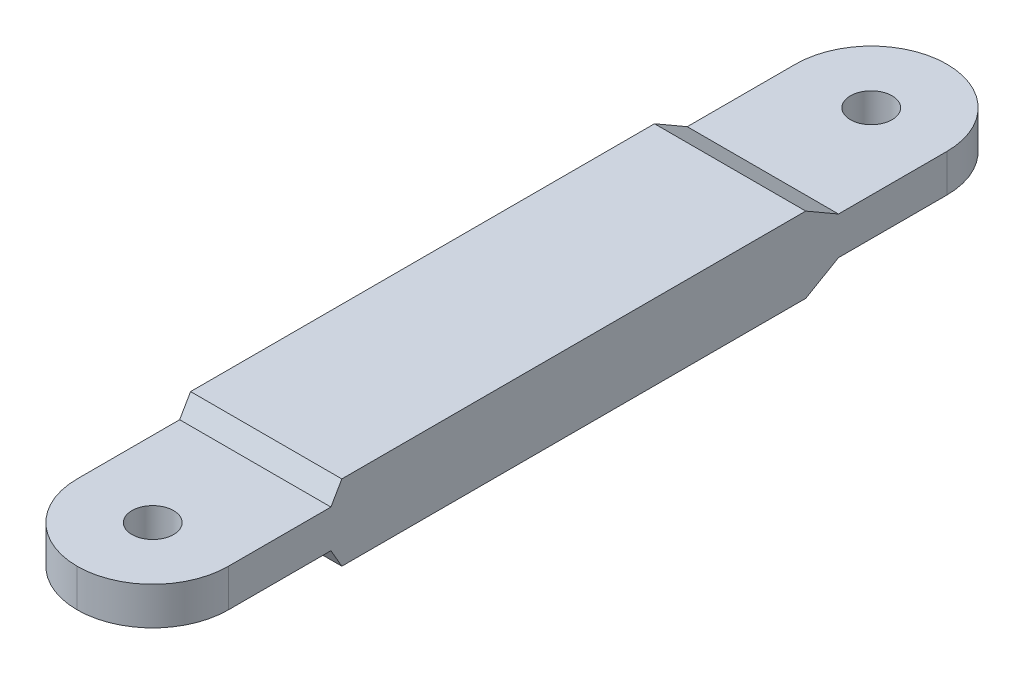
ISO-10303-21;
HEADER;
FILE_DESCRIPTION(('STEP AP214'),'2;1');
FILE_NAME('part.step','',(''),(''),'','','');
FILE_SCHEMA(('AUTOMOTIVE_DESIGN { 1 0 10303 214 1 1 1 1 }'));
ENDSEC;
DATA;
#1=APPLICATION_CONTEXT('core data for automotive mechanical design processes');
#2=APPLICATION_PROTOCOL_DEFINITION('international standard','automotive_design',2000,#1);
#3=PRODUCT_CONTEXT('',#1,'mechanical');
#4=PRODUCT('Part','Part','',(#3));
#5=PRODUCT_RELATED_PRODUCT_CATEGORY('part','',(#4));
#6=PRODUCT_DEFINITION_FORMATION('','',#4);
#7=PRODUCT_DEFINITION_CONTEXT('part definition',#1,'design');
#8=PRODUCT_DEFINITION('design','',#6,#7);
#9=PRODUCT_DEFINITION_SHAPE('','',#8);
#10=(LENGTH_UNIT() NAMED_UNIT(*) SI_UNIT(.MILLI.,.METRE.));
#11=(NAMED_UNIT(*) PLANE_ANGLE_UNIT() SI_UNIT($,.RADIAN.));
#12=(NAMED_UNIT(*) SI_UNIT($,.STERADIAN.) SOLID_ANGLE_UNIT());
#13=UNCERTAINTY_MEASURE_WITH_UNIT(LENGTH_MEASURE(1.E-05),#10,'distance_accuracy_value','');
#14=(GEOMETRIC_REPRESENTATION_CONTEXT(3) GLOBAL_UNCERTAINTY_ASSIGNED_CONTEXT((#13)) GLOBAL_UNIT_ASSIGNED_CONTEXT((#10,
#11,#12)) REPRESENTATION_CONTEXT('',''));
#15=CARTESIAN_POINT('',(0.,0.,0.));
#16=DIRECTION('',(0.,0.,1.));
#17=DIRECTION('',(1.,0.,0.));
#18=AXIS2_PLACEMENT_3D('',#15,#16,#17);
#19=CARTESIAN_POINT('',(-10.,-5.,-37.5));
#20=DIRECTION('',(-1.,0.,0.));
#21=DIRECTION('',(0.,0.,1.));
#22=AXIS2_PLACEMENT_3D('',#19,#20,#21);
#23=PLANE('',#22);
#24=DIRECTION('',(0.,0.866025403784441,0.499999999999996));
#25=VECTOR('',#24,1.);
#26=CARTESIAN_POINT('',(-10.,-35.3108891324552,15.0000000000002));
#27=LINE('',#26,#25);
#28=CARTESIAN_POINT('',(-10.,-5.,32.4999999999999));
#29=VERTEX_POINT('',#28);
#30=CARTESIAN_POINT('',(-10.,-2.5,33.943375672974));
#31=VERTEX_POINT('',#30);
#32=EDGE_CURVE('E254',#29,#31,#27,.T.);
#33=ORIENTED_EDGE('',*,*,#32,.T.);
#34=DIRECTION('',(0.,0.,-1.));
#35=VECTOR('',#34,1.);
#36=CARTESIAN_POINT('',(-10.,-2.5,57.5));
#37=LINE('',#36,#35);
#38=CARTESIAN_POINT('',(-10.,-2.5,47.5));
#39=VERTEX_POINT('',#38);
#40=EDGE_CURVE('E57',#39,#31,#37,.T.);
#41=ORIENTED_EDGE('',*,*,#40,.F.);
#42=DIRECTION('',(0.,1.,0.));
#43=VECTOR('',#42,1.);
#44=CARTESIAN_POINT('',(-10.,-5.,47.5));
#45=LINE('',#44,#43);
#46=CARTESIAN_POINT('',(-10.,2.5,47.5));
#47=VERTEX_POINT('',#46);
#48=EDGE_CURVE('E157',#39,#47,#45,.T.);
#49=ORIENTED_EDGE('',*,*,#48,.T.);
#50=DIRECTION('',(0.,0.,-1.));
#51=VECTOR('',#50,1.);
#52=CARTESIAN_POINT('',(-10.,2.5,57.5));
#53=LINE('',#52,#51);
#54=CARTESIAN_POINT('',(-10.,2.5,33.943375672974));
#55=VERTEX_POINT('',#54);
#56=EDGE_CURVE('E277',#47,#55,#53,.T.);
#57=ORIENTED_EDGE('',*,*,#56,.T.);
#58=DIRECTION('',(0.,0.866025403784441,-0.499999999999996));
#59=VECTOR('',#58,1.);
#60=CARTESIAN_POINT('',(-10.,27.8108891324551,19.3301270189224));
#61=LINE('',#60,#59);
#62=CARTESIAN_POINT('',(-10.,5.,32.4999999999999));
#63=VERTEX_POINT('',#62);
#64=EDGE_CURVE('E251',#55,#63,#61,.T.);
#65=ORIENTED_EDGE('',*,*,#64,.T.);
#66=DIRECTION('',(0.,0.,1.));
#67=VECTOR('',#66,1.);
#68=CARTESIAN_POINT('',(-10.,5.,-37.5));
#69=LINE('',#68,#67);
#70=CARTESIAN_POINT('',(-10.,5.,-28.8397459621554));
#71=VERTEX_POINT('',#70);
#72=EDGE_CURVE('E173',#71,#63,#69,.T.);
#73=ORIENTED_EDGE('',*,*,#72,.F.);
#74=DIRECTION('',(0.,0.499999999999997,0.866025403784441));
#75=VECTOR('',#74,1.);
#76=CARTESIAN_POINT('',(-10.,-1.25000000000003,-39.6650635094611));
#77=LINE('',#76,#75);
#78=CARTESIAN_POINT('',(-10.,2.5,-33.1698729810777));
#79=VERTEX_POINT('',#78);
#80=EDGE_CURVE('E248',#71,#79,#77,.F.);
#81=ORIENTED_EDGE('',*,*,#80,.T.);
#82=DIRECTION('',(0.,0.,1.));
#83=VECTOR('',#82,1.);
#84=CARTESIAN_POINT('',(-10.,2.5,-57.5));
#85=LINE('',#84,#83);
#86=CARTESIAN_POINT('',(-10.,2.5,-47.5));
#87=VERTEX_POINT('',#86);
#88=EDGE_CURVE('E74',#87,#79,#85,.T.);
#89=ORIENTED_EDGE('',*,*,#88,.F.);
#90=DIRECTION('',(0.,1.,0.));
#91=VECTOR('',#90,1.);
#92=CARTESIAN_POINT('',(-10.,-5.,-47.5));
#93=LINE('',#92,#91);
#94=CARTESIAN_POINT('',(-10.,-2.5,-47.5));
#95=VERTEX_POINT('',#94);
#96=EDGE_CURVE('E177',#87,#95,#93,.F.);
#97=ORIENTED_EDGE('',*,*,#96,.T.);
#98=DIRECTION('',(0.,0.,1.));
#99=VECTOR('',#98,1.);
#100=CARTESIAN_POINT('',(-10.,-2.5,-57.5));
#101=LINE('',#100,#99);
#102=CARTESIAN_POINT('',(-10.,-2.5,-33.1698729810777));
#103=VERTEX_POINT('',#102);
#104=EDGE_CURVE('E82',#95,#103,#101,.T.);
#105=ORIENTED_EDGE('',*,*,#104,.T.);
#106=DIRECTION('',(0.,0.499999999999997,-0.866025403784441));
#107=VECTOR('',#106,1.);
#108=CARTESIAN_POINT('',(-10.,-1.24999999999994,-35.3349364905389));
#109=LINE('',#108,#107);
#110=CARTESIAN_POINT('',(-10.,-5.,-28.8397459621554));
#111=VERTEX_POINT('',#110);
#112=EDGE_CURVE('E245',#103,#111,#109,.F.);
#113=ORIENTED_EDGE('',*,*,#112,.T.);
#114=DIRECTION('',(0.,0.,1.));
#115=VECTOR('',#114,1.);
#116=CARTESIAN_POINT('',(-10.,-5.,-37.5));
#117=LINE('',#116,#115);
#118=EDGE_CURVE('E183',#111,#29,#117,.T.);
#119=ORIENTED_EDGE('',*,*,#118,.T.);
#120=EDGE_LOOP('',(#33,#41,#49,#57,#65,#73,#81,#89,#97,#105,#113,#119));
#121=FACE_BOUND('',#120,.T.);
#122=ADVANCED_FACE('F39',(#121),#23,.T.);
#123=CARTESIAN_POINT('',(-10.,5.,-37.5));
#124=DIRECTION('',(0.,1.,0.));
#125=DIRECTION('',(0.,0.,1.));
#126=AXIS2_PLACEMENT_3D('',#123,#124,#125);
#127=PLANE('',#126);
#128=ORIENTED_EDGE('',*,*,#72,.T.);
#129=DIRECTION('',(1.,0.,0.));
#130=VECTOR('',#129,1.);
#131=CARTESIAN_POINT('',(10.,5.,32.4999999999999));
#132=LINE('',#131,#130);
#133=CARTESIAN_POINT('',(10.,5.,32.4999999999999));
#134=VERTEX_POINT('',#133);
#135=EDGE_CURVE('E261',#63,#134,#132,.T.);
#136=ORIENTED_EDGE('',*,*,#135,.T.);
#137=DIRECTION('',(0.,0.,1.));
#138=VECTOR('',#137,1.);
#139=CARTESIAN_POINT('',(10.,5.,-37.5));
#140=LINE('',#139,#138);
#141=CARTESIAN_POINT('',(10.,5.,-28.8397459621554));
#142=VERTEX_POINT('',#141);
#143=EDGE_CURVE('E180',#142,#134,#140,.T.);
#144=ORIENTED_EDGE('',*,*,#143,.F.);
#145=DIRECTION('',(-1.,0.,0.));
#146=VECTOR('',#145,1.);
#147=CARTESIAN_POINT('',(-10.,5.,-28.8397459621554));
#148=LINE('',#147,#146);
#149=EDGE_CURVE('E257',#142,#71,#148,.T.);
#150=ORIENTED_EDGE('',*,*,#149,.T.);
#151=EDGE_LOOP('',(#128,#136,#144,#150));
#152=FACE_BOUND('',#151,.T.);
#153=ADVANCED_FACE('F285',(#152),#127,.T.);
#154=CARTESIAN_POINT('',(10.,-5.,-37.5));
#155=DIRECTION('',(1.,0.,0.));
#156=DIRECTION('',(0.,0.,-1.));
#157=AXIS2_PLACEMENT_3D('',#154,#155,#156);
#158=PLANE('',#157);
#159=DIRECTION('',(0.,0.,-1.));
#160=VECTOR('',#159,1.);
#161=CARTESIAN_POINT('',(10.,-2.5,57.5));
#162=LINE('',#161,#160);
#163=CARTESIAN_POINT('',(10.,-2.5,47.5));
#164=VERTEX_POINT('',#163);
#165=CARTESIAN_POINT('',(10.,-2.5,33.943375672974));
#166=VERTEX_POINT('',#165);
#167=EDGE_CURVE('E219',#164,#166,#162,.T.);
#168=ORIENTED_EDGE('',*,*,#167,.T.);
#169=DIRECTION('',(0.,-0.866025403784441,-0.499999999999996));
#170=VECTOR('',#169,1.);
#171=CARTESIAN_POINT('',(10.,-35.3108891324552,15.0000000000002));
#172=LINE('',#171,#170);
#173=CARTESIAN_POINT('',(10.,-5.,32.4999999999999));
#174=VERTEX_POINT('',#173);
#175=EDGE_CURVE('E234',#166,#174,#172,.T.);
#176=ORIENTED_EDGE('',*,*,#175,.T.);
#177=DIRECTION('',(0.,0.,1.));
#178=VECTOR('',#177,1.);
#179=CARTESIAN_POINT('',(10.,-5.,-37.5));
#180=LINE('',#179,#178);
#181=CARTESIAN_POINT('',(10.,-5.,-28.8397459621554));
#182=VERTEX_POINT('',#181);
#183=EDGE_CURVE('E306',#182,#174,#180,.T.);
#184=ORIENTED_EDGE('',*,*,#183,.F.);
#185=DIRECTION('',(0.,-0.499999999999997,0.866025403784441));
#186=VECTOR('',#185,1.);
#187=CARTESIAN_POINT('',(10.,-1.24999999999994,-35.3349364905389));
#188=LINE('',#187,#186);
#189=CARTESIAN_POINT('',(10.,-2.5,-33.1698729810777));
#190=VERTEX_POINT('',#189);
#191=EDGE_CURVE('E214',#182,#190,#188,.F.);
#192=ORIENTED_EDGE('',*,*,#191,.T.);
#193=DIRECTION('',(0.,0.,1.));
#194=VECTOR('',#193,1.);
#195=CARTESIAN_POINT('',(10.,-2.5,-57.5));
#196=LINE('',#195,#194);
#197=CARTESIAN_POINT('',(10.,-2.5,-47.5));
#198=VERTEX_POINT('',#197);
#199=EDGE_CURVE('E152',#198,#190,#196,.T.);
#200=ORIENTED_EDGE('',*,*,#199,.F.);
#201=DIRECTION('',(0.,-1.,0.));
#202=VECTOR('',#201,1.);
#203=CARTESIAN_POINT('',(10.,-5.,-47.5));
#204=LINE('',#203,#202);
#205=CARTESIAN_POINT('',(10.,2.5,-47.5));
#206=VERTEX_POINT('',#205);
#207=EDGE_CURVE('E146',#198,#206,#204,.F.);
#208=ORIENTED_EDGE('',*,*,#207,.T.);
#209=DIRECTION('',(0.,0.,1.));
#210=VECTOR('',#209,1.);
#211=CARTESIAN_POINT('',(10.,2.5,-57.5));
#212=LINE('',#211,#210);
#213=CARTESIAN_POINT('',(10.,2.5,-33.1698729810777));
#214=VERTEX_POINT('',#213);
#215=EDGE_CURVE('E149',#206,#214,#212,.T.);
#216=ORIENTED_EDGE('',*,*,#215,.T.);
#217=DIRECTION('',(0.,-0.499999999999997,-0.866025403784441));
#218=VECTOR('',#217,1.);
#219=CARTESIAN_POINT('',(10.,-1.25000000000003,-39.6650635094611));
#220=LINE('',#219,#218);
#221=EDGE_CURVE('E227',#214,#142,#220,.F.);
#222=ORIENTED_EDGE('',*,*,#221,.T.);
#223=ORIENTED_EDGE('',*,*,#143,.T.);
#224=DIRECTION('',(0.,-0.866025403784441,0.499999999999996));
#225=VECTOR('',#224,1.);
#226=CARTESIAN_POINT('',(10.,27.8108891324551,19.3301270189224));
#227=LINE('',#226,#225);
#228=CARTESIAN_POINT('',(10.,2.5,33.943375672974));
#229=VERTEX_POINT('',#228);
#230=EDGE_CURVE('E230',#134,#229,#227,.T.);
#231=ORIENTED_EDGE('',*,*,#230,.T.);
#232=DIRECTION('',(0.,0.,-1.));
#233=VECTOR('',#232,1.);
#234=CARTESIAN_POINT('',(10.,2.5,57.5));
#235=LINE('',#234,#233);
#236=CARTESIAN_POINT('',(10.,2.5,47.5));
#237=VERTEX_POINT('',#236);
#238=EDGE_CURVE('E279',#237,#229,#235,.T.);
#239=ORIENTED_EDGE('',*,*,#238,.F.);
#240=DIRECTION('',(0.,-1.,0.));
#241=VECTOR('',#240,1.);
#242=CARTESIAN_POINT('',(10.,-5.,47.5));
#243=LINE('',#242,#241);
#244=EDGE_CURVE('E211',#237,#164,#243,.T.);
#245=ORIENTED_EDGE('',*,*,#244,.T.);
#246=EDGE_LOOP('',(#168,#176,#184,#192,#200,#208,#216,#222,#223,#231,#239,#245));
#247=FACE_BOUND('',#246,.T.);
#248=ADVANCED_FACE('F148',(#247),#158,.T.);
#249=CARTESIAN_POINT('',(-10.,-5.,-37.5));
#250=DIRECTION('',(0.,-1.,0.));
#251=DIRECTION('',(0.,0.,-1.));
#252=AXIS2_PLACEMENT_3D('',#249,#250,#251);
#253=PLANE('',#252);
#254=ORIENTED_EDGE('',*,*,#183,.T.);
#255=DIRECTION('',(-1.,0.,0.));
#256=VECTOR('',#255,1.);
#257=CARTESIAN_POINT('',(-10.,-5.,32.4999999999999));
#258=LINE('',#257,#256);
#259=EDGE_CURVE('E241',#174,#29,#258,.T.);
#260=ORIENTED_EDGE('',*,*,#259,.T.);
#261=ORIENTED_EDGE('',*,*,#118,.F.);
#262=DIRECTION('',(1.,0.,0.));
#263=VECTOR('',#262,1.);
#264=CARTESIAN_POINT('',(-10.,-5.,-28.8397459621554));
#265=LINE('',#264,#263);
#266=EDGE_CURVE('E237',#111,#182,#265,.T.);
#267=ORIENTED_EDGE('',*,*,#266,.T.);
#268=EDGE_LOOP('',(#254,#260,#261,#267));
#269=FACE_BOUND('',#268,.T.);
#270=ADVANCED_FACE('F317',(#269),#253,.T.);
#271=CARTESIAN_POINT('',(10.,-2.5,-57.5));
#272=DIRECTION('',(0.,1.,0.));
#273=DIRECTION('',(0.,0.,1.));
#274=AXIS2_PLACEMENT_3D('',#271,#272,#273);
#275=PLANE('',#274);
#276=CARTESIAN_POINT('',(0.,-2.5,-47.5));
#277=DIRECTION('',(0.,1.,0.));
#278=DIRECTION('',(0.,0.,1.));
#279=AXIS2_PLACEMENT_3D('',#276,#277,#278);
#280=CIRCLE('',#279,2.75);
#281=CARTESIAN_POINT('',(0.,-2.5,-44.75));
#282=VERTEX_POINT('',#281);
#283=EDGE_CURVE('E195',#282,#282,#280,.T.);
#284=ORIENTED_EDGE('',*,*,#283,.T.);
#285=EDGE_LOOP('',(#284));
#286=FACE_BOUND('',#285,.T.);
#287=ORIENTED_EDGE('',*,*,#104,.F.);
#288=CARTESIAN_POINT('',(0.,-2.5,-47.5));
#289=DIRECTION('',(0.,1.,0.));
#290=DIRECTION('',(0.,0.,1.));
#291=AXIS2_PLACEMENT_3D('',#288,#289,#290);
#292=CIRCLE('',#291,10.);
#293=CARTESIAN_POINT('',(0.,-2.5,-57.5));
#294=VERTEX_POINT('',#293);
#295=EDGE_CURVE('E158',#95,#294,#292,.F.);
#296=ORIENTED_EDGE('',*,*,#295,.T.);
#297=CARTESIAN_POINT('',(0.,-2.5,-47.5));
#298=DIRECTION('',(0.,1.,0.));
#299=DIRECTION('',(0.,0.,1.));
#300=AXIS2_PLACEMENT_3D('',#297,#298,#299);
#301=CIRCLE('',#300,10.);
#302=EDGE_CURVE('E188',#294,#198,#301,.F.);
#303=ORIENTED_EDGE('',*,*,#302,.T.);
#304=ORIENTED_EDGE('',*,*,#199,.T.);
#305=DIRECTION('',(1.,0.,0.));
#306=VECTOR('',#305,1.);
#307=CARTESIAN_POINT('',(10.,-2.5,-33.1698729810777));
#308=LINE('',#307,#306);
#309=EDGE_CURVE('E11',#190,#103,#308,.F.);
#310=ORIENTED_EDGE('',*,*,#309,.T.);
#311=EDGE_LOOP('',(#287,#296,#303,#304,#310));
#312=FACE_BOUND('',#311,.T.);
#313=ADVANCED_FACE('F297',(#286,#312),#275,.F.);
#314=CARTESIAN_POINT('',(10.,2.5,-57.5));
#315=DIRECTION('',(0.,-1.,0.));
#316=DIRECTION('',(0.,0.,-1.));
#317=AXIS2_PLACEMENT_3D('',#314,#315,#316);
#318=PLANE('',#317);
#319=CARTESIAN_POINT('',(0.,2.5,-47.5));
#320=DIRECTION('',(0.,1.,0.));
#321=DIRECTION('',(0.,0.,1.));
#322=AXIS2_PLACEMENT_3D('',#319,#320,#321);
#323=CIRCLE('',#322,2.75);
#324=CARTESIAN_POINT('',(0.,2.5,-44.75));
#325=VERTEX_POINT('',#324);
#326=EDGE_CURVE('E344',#325,#325,#323,.T.);
#327=ORIENTED_EDGE('',*,*,#326,.F.);
#328=EDGE_LOOP('',(#327));
#329=FACE_BOUND('',#328,.T.);
#330=CARTESIAN_POINT('',(0.,2.5,-47.5));
#331=DIRECTION('',(0.,-1.,0.));
#332=DIRECTION('',(0.,0.,-1.));
#333=AXIS2_PLACEMENT_3D('',#330,#331,#332);
#334=CIRCLE('',#333,10.);
#335=CARTESIAN_POINT('',(0.,2.5,-57.5));
#336=VERTEX_POINT('',#335);
#337=EDGE_CURVE('E161',#206,#336,#334,.F.);
#338=ORIENTED_EDGE('',*,*,#337,.T.);
#339=CARTESIAN_POINT('',(0.,2.5,-47.5));
#340=DIRECTION('',(0.,-1.,0.));
#341=DIRECTION('',(0.,0.,-1.));
#342=AXIS2_PLACEMENT_3D('',#339,#340,#341);
#343=CIRCLE('',#342,10.);
#344=EDGE_CURVE('E172',#336,#87,#343,.F.);
#345=ORIENTED_EDGE('',*,*,#344,.T.);
#346=ORIENTED_EDGE('',*,*,#88,.T.);
#347=DIRECTION('',(-1.,0.,0.));
#348=VECTOR('',#347,1.);
#349=CARTESIAN_POINT('',(10.,2.5,-33.1698729810777));
#350=LINE('',#349,#348);
#351=EDGE_CURVE('E49',#79,#214,#350,.F.);
#352=ORIENTED_EDGE('',*,*,#351,.T.);
#353=ORIENTED_EDGE('',*,*,#215,.F.);
#354=EDGE_LOOP('',(#338,#345,#346,#352,#353));
#355=FACE_BOUND('',#354,.T.);
#356=ADVANCED_FACE('F160',(#329,#355),#318,.F.);
#357=CARTESIAN_POINT('',(0.,0.,-47.5));
#358=DIRECTION('',(0.,-1.,0.));
#359=DIRECTION('',(0.,0.,-1.));
#360=AXIS2_PLACEMENT_3D('',#357,#358,#359);
#361=CYLINDRICAL_SURFACE('',#360,10.);
#362=ORIENTED_EDGE('',*,*,#207,.F.);
#363=ORIENTED_EDGE('',*,*,#302,.F.);
#364=DIRECTION('',(0.,-1.,0.));
#365=VECTOR('',#364,1.);
#366=CARTESIAN_POINT('',(0.,0.,-57.5));
#367=LINE('',#366,#365);
#368=EDGE_CURVE('E166',#336,#294,#367,.T.);
#369=ORIENTED_EDGE('',*,*,#368,.F.);
#370=ORIENTED_EDGE('',*,*,#337,.F.);
#371=EDGE_LOOP('',(#362,#363,#369,#370));
#372=FACE_BOUND('',#371,.T.);
#373=ADVANCED_FACE('F168',(#372),#361,.T.);
#374=CARTESIAN_POINT('',(0.,0.,-47.5));
#375=DIRECTION('',(0.,1.,0.));
#376=DIRECTION('',(0.,0.,1.));
#377=AXIS2_PLACEMENT_3D('',#374,#375,#376);
#378=CYLINDRICAL_SURFACE('',#377,10.);
#379=ORIENTED_EDGE('',*,*,#295,.F.);
#380=ORIENTED_EDGE('',*,*,#96,.F.);
#381=ORIENTED_EDGE('',*,*,#344,.F.);
#382=ORIENTED_EDGE('',*,*,#368,.T.);
#383=EDGE_LOOP('',(#379,#380,#381,#382));
#384=FACE_BOUND('',#383,.T.);
#385=ADVANCED_FACE('F295',(#384),#378,.T.);
#386=CARTESIAN_POINT('',(0.,-5.,-47.5));
#387=DIRECTION('',(0.,1.,0.));
#388=DIRECTION('',(0.,0.,1.));
#389=AXIS2_PLACEMENT_3D('',#386,#387,#388);
#390=CYLINDRICAL_SURFACE('',#389,2.75);
#391=CARTESIAN_POINT('',(0.,2.5,-44.75));
#392=CARTESIAN_POINT('',(0.,2.44791666666667,-44.75));
#393=CARTESIAN_POINT('',(0.,2.39583333333333,-44.75));
#394=CARTESIAN_POINT('',(0.,2.29166666666667,-44.75));
#395=CARTESIAN_POINT('',(0.,2.23958333333333,-44.75));
#396=CARTESIAN_POINT('',(0.,2.13541666666667,-44.75));
#397=CARTESIAN_POINT('',(0.,2.08333333333333,-44.75));
#398=CARTESIAN_POINT('',(0.,1.97916666666667,-44.75));
#399=CARTESIAN_POINT('',(0.,1.92708333333333,-44.75));
#400=CARTESIAN_POINT('',(0.,1.82291666666667,-44.75));
#401=CARTESIAN_POINT('',(0.,1.77083333333333,-44.75));
#402=CARTESIAN_POINT('',(0.,1.66666666666667,-44.75));
#403=CARTESIAN_POINT('',(0.,1.61458333333333,-44.75));
#404=CARTESIAN_POINT('',(0.,1.51041666666667,-44.75));
#405=CARTESIAN_POINT('',(0.,1.45833333333333,-44.75));
#406=CARTESIAN_POINT('',(0.,1.35416666666667,-44.75));
#407=CARTESIAN_POINT('',(0.,1.30208333333333,-44.75));
#408=CARTESIAN_POINT('',(0.,1.19791666666667,-44.75));
#409=CARTESIAN_POINT('',(0.,1.14583333333333,-44.75));
#410=CARTESIAN_POINT('',(0.,1.04166666666667,-44.75));
#411=CARTESIAN_POINT('',(0.,0.989583333333333,-44.75));
#412=CARTESIAN_POINT('',(0.,0.885416666666667,-44.75));
#413=CARTESIAN_POINT('',(0.,0.833333333333333,-44.75));
#414=CARTESIAN_POINT('',(0.,0.729166666666667,-44.75));
#415=CARTESIAN_POINT('',(0.,0.677083333333333,-44.75));
#416=CARTESIAN_POINT('',(0.,0.572916666666666,-44.75));
#417=CARTESIAN_POINT('',(0.,0.520833333333333,-44.75));
#418=CARTESIAN_POINT('',(0.,0.416666666666666,-44.75));
#419=CARTESIAN_POINT('',(0.,0.364583333333333,-44.75));
#420=CARTESIAN_POINT('',(0.,0.260416666666667,-44.75));
#421=CARTESIAN_POINT('',(0.,0.208333333333334,-44.75));
#422=CARTESIAN_POINT('',(0.,0.104166666666667,-44.75));
#423=CARTESIAN_POINT('',(0.,0.0520833333333334,-44.75));
#424=CARTESIAN_POINT('',(0.,-0.0520833333333334,-44.75));
#425=CARTESIAN_POINT('',(0.,-0.104166666666667,-44.75));
#426=CARTESIAN_POINT('',(0.,-0.208333333333334,-44.75));
#427=CARTESIAN_POINT('',(0.,-0.260416666666667,-44.75));
#428=CARTESIAN_POINT('',(0.,-0.364583333333334,-44.75));
#429=CARTESIAN_POINT('',(0.,-0.416666666666667,-44.75));
#430=CARTESIAN_POINT('',(0.,-0.520833333333334,-44.75));
#431=CARTESIAN_POINT('',(0.,-0.572916666666667,-44.75));
#432=CARTESIAN_POINT('',(0.,-0.677083333333334,-44.75));
#433=CARTESIAN_POINT('',(0.,-0.729166666666667,-44.75));
#434=CARTESIAN_POINT('',(0.,-0.833333333333334,-44.75));
#435=CARTESIAN_POINT('',(0.,-0.885416666666668,-44.75));
#436=CARTESIAN_POINT('',(0.,-0.989583333333334,-44.75));
#437=CARTESIAN_POINT('',(0.,-1.04166666666667,-44.75));
#438=CARTESIAN_POINT('',(0.,-1.14583333333333,-44.75));
#439=CARTESIAN_POINT('',(0.,-1.19791666666667,-44.75));
#440=CARTESIAN_POINT('',(0.,-1.30208333333333,-44.75));
#441=CARTESIAN_POINT('',(0.,-1.35416666666667,-44.75));
#442=CARTESIAN_POINT('',(0.,-1.45833333333333,-44.75));
#443=CARTESIAN_POINT('',(0.,-1.51041666666667,-44.75));
#444=CARTESIAN_POINT('',(0.,-1.61458333333333,-44.75));
#445=CARTESIAN_POINT('',(0.,-1.66666666666667,-44.75));
#446=CARTESIAN_POINT('',(0.,-1.77083333333333,-44.75));
#447=CARTESIAN_POINT('',(0.,-1.82291666666667,-44.75));
#448=CARTESIAN_POINT('',(0.,-1.92708333333333,-44.75));
#449=CARTESIAN_POINT('',(0.,-1.97916666666667,-44.75));
#450=CARTESIAN_POINT('',(0.,-2.08333333333333,-44.75));
#451=CARTESIAN_POINT('',(0.,-2.13541666666667,-44.75));
#452=CARTESIAN_POINT('',(0.,-2.23958333333333,-44.75));
#453=CARTESIAN_POINT('',(0.,-2.29166666666667,-44.75));
#454=CARTESIAN_POINT('',(0.,-2.39583333333333,-44.75));
#455=CARTESIAN_POINT('',(0.,-2.44791666666667,-44.75));
#456=CARTESIAN_POINT('',(0.,-2.5,-44.75));
#457=B_SPLINE_CURVE_WITH_KNOTS('',3,(#391,#392,#393,#394,#395,#396,#397,#398,#399,#400,#401,
#402,#403,#404,#405,#406,#407,#408,#409,#410,#411,#412,#413,#414,#415,#416,#417,#418,#419,#420,
#421,#422,#423,#424,#425,#426,#427,#428,#429,#430,#431,#432,#433,#434,#435,#436,#437,#438,#439,
#440,#441,#442,#443,#444,#445,#446,#447,#448,#449,#450,#451,#452,#453,#454,#455,#456),
.UNSPECIFIED.,.F.,.F.,(4,2,2,2,2,2,2,2,2,2,2,2,2,2,2,2,2,2,2,2,2,2,2,2,2,2,2,2,2,2,2,2,4),(0.,
0.15625,0.3125,0.46875,0.625000000000001,0.781250000000001,0.937500000000001,1.09375,1.25,
1.40625,1.5625,1.71875,1.875,2.03125,2.1875,2.34375,2.5,2.65625,2.8125,2.96875,3.125,3.28125,
3.4375,3.59375,3.75,3.90625,4.0625,4.21875,4.375,4.53125,4.6875,4.84375,5.),.UNSPECIFIED.);
#458=EDGE_CURVE('BSEAM353',#325,#282,#457,.T.);
#459=ORIENTED_EDGE('',*,*,#326,.T.);
#460=ORIENTED_EDGE('',*,*,#283,.F.);
#461=ORIENTED_EDGE('',*,*,#458,.T.);
#462=ORIENTED_EDGE('',*,*,#458,.F.);
#463=EDGE_LOOP('',(#459,#461,#460,#462));
#464=FACE_BOUND('',#463,.T.);
#465=ADVANCED_FACE('F353',(#464),#390,.F.);
#466=CARTESIAN_POINT('',(10.,2.5,57.5));
#467=DIRECTION('',(0.,1.,0.));
#468=DIRECTION('',(0.,0.,1.));
#469=AXIS2_PLACEMENT_3D('',#466,#467,#468);
#470=PLANE('',#469);
#471=CARTESIAN_POINT('',(0.,2.5,47.5));
#472=DIRECTION('',(0.,-1.,0.));
#473=DIRECTION('',(0.,0.,-1.));
#474=AXIS2_PLACEMENT_3D('',#471,#472,#473);
#475=CIRCLE('',#474,2.75);
#476=CARTESIAN_POINT('',(0.,2.5,50.25));
#477=VERTEX_POINT('',#476);
#478=EDGE_CURVE('E224',#477,#477,#475,.T.);
#479=ORIENTED_EDGE('',*,*,#478,.T.);
#480=EDGE_LOOP('',(#479));
#481=FACE_BOUND('',#480,.T.);
#482=ORIENTED_EDGE('',*,*,#56,.F.);
#483=CARTESIAN_POINT('',(0.,2.5,47.5));
#484=DIRECTION('',(0.,1.,0.));
#485=DIRECTION('',(0.,0.,1.));
#486=AXIS2_PLACEMENT_3D('',#483,#484,#485);
#487=CIRCLE('',#486,10.);
#488=CARTESIAN_POINT('',(0.,2.5,57.5));
#489=VERTEX_POINT('',#488);
#490=EDGE_CURVE('E202',#47,#489,#487,.T.);
#491=ORIENTED_EDGE('',*,*,#490,.T.);
#492=CARTESIAN_POINT('',(0.,2.5,47.5));
#493=DIRECTION('',(0.,1.,0.));
#494=DIRECTION('',(0.,0.,1.));
#495=AXIS2_PLACEMENT_3D('',#492,#493,#494);
#496=CIRCLE('',#495,10.);
#497=EDGE_CURVE('E199',#489,#237,#496,.T.);
#498=ORIENTED_EDGE('',*,*,#497,.T.);
#499=ORIENTED_EDGE('',*,*,#238,.T.);
#500=DIRECTION('',(-1.,0.,0.));
#501=VECTOR('',#500,1.);
#502=CARTESIAN_POINT('',(0.,2.5,33.943375672974));
#503=LINE('',#502,#501);
#504=EDGE_CURVE('E268',#229,#55,#503,.T.);
#505=ORIENTED_EDGE('',*,*,#504,.T.);
#506=EDGE_LOOP('',(#482,#491,#498,#499,#505));
#507=FACE_BOUND('',#506,.T.);
#508=ADVANCED_FACE('F276',(#481,#507),#470,.T.);
#509=CARTESIAN_POINT('',(10.,-2.5,57.5));
#510=DIRECTION('',(0.,-1.,0.));
#511=DIRECTION('',(0.,0.,-1.));
#512=AXIS2_PLACEMENT_3D('',#509,#510,#511);
#513=PLANE('',#512);
#514=CARTESIAN_POINT('',(0.,-2.5,47.5));
#515=DIRECTION('',(0.,-1.,0.));
#516=DIRECTION('',(0.,0.,-1.));
#517=AXIS2_PLACEMENT_3D('',#514,#515,#516);
#518=CIRCLE('',#517,2.75);
#519=CARTESIAN_POINT('',(0.,-2.5,50.25));
#520=VERTEX_POINT('',#519);
#521=EDGE_CURVE('E220',#520,#520,#518,.F.);
#522=ORIENTED_EDGE('',*,*,#521,.T.);
#523=EDGE_LOOP('',(#522));
#524=FACE_BOUND('',#523,.T.);
#525=CARTESIAN_POINT('',(0.,-2.5,47.5));
#526=DIRECTION('',(0.,-1.,0.));
#527=DIRECTION('',(0.,0.,-1.));
#528=AXIS2_PLACEMENT_3D('',#525,#526,#527);
#529=CIRCLE('',#528,10.);
#530=CARTESIAN_POINT('',(0.,-2.5,57.5));
#531=VERTEX_POINT('',#530);
#532=EDGE_CURVE('E205',#164,#531,#529,.T.);
#533=ORIENTED_EDGE('',*,*,#532,.T.);
#534=CARTESIAN_POINT('',(0.,-2.5,47.5));
#535=DIRECTION('',(0.,-1.,0.));
#536=DIRECTION('',(0.,0.,-1.));
#537=AXIS2_PLACEMENT_3D('',#534,#535,#536);
#538=CIRCLE('',#537,10.);
#539=EDGE_CURVE('E208',#531,#39,#538,.T.);
#540=ORIENTED_EDGE('',*,*,#539,.T.);
#541=ORIENTED_EDGE('',*,*,#40,.T.);
#542=DIRECTION('',(1.,0.,0.));
#543=VECTOR('',#542,1.);
#544=CARTESIAN_POINT('',(0.,-2.5,33.943375672974));
#545=LINE('',#544,#543);
#546=EDGE_CURVE('E265',#31,#166,#545,.T.);
#547=ORIENTED_EDGE('',*,*,#546,.T.);
#548=ORIENTED_EDGE('',*,*,#167,.F.);
#549=EDGE_LOOP('',(#533,#540,#541,#547,#548));
#550=FACE_BOUND('',#549,.T.);
#551=ADVANCED_FACE('F323',(#524,#550),#513,.T.);
#552=CARTESIAN_POINT('',(0.,-5.,47.5));
#553=DIRECTION('',(0.,-1.,0.));
#554=DIRECTION('',(0.,0.,-1.));
#555=AXIS2_PLACEMENT_3D('',#552,#553,#554);
#556=CYLINDRICAL_SURFACE('',#555,10.);
#557=DIRECTION('',(0.,-1.,0.));
#558=VECTOR('',#557,1.);
#559=CARTESIAN_POINT('',(0.,0.,57.5));
#560=LINE('',#559,#558);
#561=EDGE_CURVE('E215',#531,#489,#560,.F.);
#562=ORIENTED_EDGE('',*,*,#561,.F.);
#563=ORIENTED_EDGE('',*,*,#532,.F.);
#564=ORIENTED_EDGE('',*,*,#244,.F.);
#565=ORIENTED_EDGE('',*,*,#497,.F.);
#566=EDGE_LOOP('',(#562,#563,#564,#565));
#567=FACE_BOUND('',#566,.T.);
#568=ADVANCED_FACE('F330',(#567),#556,.T.);
#569=CARTESIAN_POINT('',(0.,-5.,47.5));
#570=DIRECTION('',(0.,1.,0.));
#571=DIRECTION('',(0.,0.,1.));
#572=AXIS2_PLACEMENT_3D('',#569,#570,#571);
#573=CYLINDRICAL_SURFACE('',#572,10.);
#574=ORIENTED_EDGE('',*,*,#539,.F.);
#575=ORIENTED_EDGE('',*,*,#561,.T.);
#576=ORIENTED_EDGE('',*,*,#490,.F.);
#577=ORIENTED_EDGE('',*,*,#48,.F.);
#578=EDGE_LOOP('',(#574,#575,#576,#577));
#579=FACE_BOUND('',#578,.T.);
#580=ADVANCED_FACE('F335',(#579),#573,.T.);
#581=CARTESIAN_POINT('',(0.,-5.,47.5));
#582=DIRECTION('',(0.,1.,0.));
#583=DIRECTION('',(0.,0.,1.));
#584=AXIS2_PLACEMENT_3D('',#581,#582,#583);
#585=CYLINDRICAL_SURFACE('',#584,2.75);
#586=CARTESIAN_POINT('',(0.,-2.5,50.25));
#587=CARTESIAN_POINT('',(0.,-2.44791666666667,50.25));
#588=CARTESIAN_POINT('',(0.,-2.39583333333333,50.25));
#589=CARTESIAN_POINT('',(0.,-2.29166666666667,50.25));
#590=CARTESIAN_POINT('',(0.,-2.23958333333333,50.25));
#591=CARTESIAN_POINT('',(0.,-2.13541666666667,50.25));
#592=CARTESIAN_POINT('',(0.,-2.08333333333333,50.25));
#593=CARTESIAN_POINT('',(0.,-1.97916666666667,50.25));
#594=CARTESIAN_POINT('',(0.,-1.92708333333333,50.25));
#595=CARTESIAN_POINT('',(0.,-1.82291666666667,50.25));
#596=CARTESIAN_POINT('',(0.,-1.77083333333333,50.25));
#597=CARTESIAN_POINT('',(0.,-1.66666666666667,50.25));
#598=CARTESIAN_POINT('',(0.,-1.61458333333333,50.25));
#599=CARTESIAN_POINT('',(0.,-1.51041666666667,50.25));
#600=CARTESIAN_POINT('',(0.,-1.45833333333333,50.25));
#601=CARTESIAN_POINT('',(0.,-1.35416666666667,50.25));
#602=CARTESIAN_POINT('',(0.,-1.30208333333333,50.25));
#603=CARTESIAN_POINT('',(0.,-1.19791666666667,50.25));
#604=CARTESIAN_POINT('',(0.,-1.14583333333333,50.25));
#605=CARTESIAN_POINT('',(0.,-1.04166666666667,50.25));
#606=CARTESIAN_POINT('',(0.,-0.989583333333333,50.25));
#607=CARTESIAN_POINT('',(0.,-0.885416666666667,50.25));
#608=CARTESIAN_POINT('',(0.,-0.833333333333334,50.25));
#609=CARTESIAN_POINT('',(0.,-0.729166666666667,50.25));
#610=CARTESIAN_POINT('',(0.,-0.677083333333334,50.25));
#611=CARTESIAN_POINT('',(0.,-0.572916666666667,50.25));
#612=CARTESIAN_POINT('',(0.,-0.520833333333334,50.25));
#613=CARTESIAN_POINT('',(0.,-0.416666666666667,50.25));
#614=CARTESIAN_POINT('',(0.,-0.364583333333334,50.25));
#615=CARTESIAN_POINT('',(0.,-0.260416666666667,50.25));
#616=CARTESIAN_POINT('',(0.,-0.208333333333334,50.25));
#617=CARTESIAN_POINT('',(0.,-0.104166666666667,50.25));
#618=CARTESIAN_POINT('',(0.,-0.0520833333333334,50.25));
#619=CARTESIAN_POINT('',(0.,0.0520833333333334,50.25));
#620=CARTESIAN_POINT('',(0.,0.104166666666667,50.25));
#621=CARTESIAN_POINT('',(0.,0.208333333333334,50.25));
#622=CARTESIAN_POINT('',(0.,0.260416666666667,50.25));
#623=CARTESIAN_POINT('',(0.,0.364583333333334,50.25));
#624=CARTESIAN_POINT('',(0.,0.416666666666667,50.25));
#625=CARTESIAN_POINT('',(0.,0.520833333333334,50.25));
#626=CARTESIAN_POINT('',(0.,0.572916666666667,50.25));
#627=CARTESIAN_POINT('',(0.,0.677083333333334,50.25));
#628=CARTESIAN_POINT('',(0.,0.729166666666667,50.25));
#629=CARTESIAN_POINT('',(0.,0.833333333333334,50.25));
#630=CARTESIAN_POINT('',(0.,0.885416666666667,50.25));
#631=CARTESIAN_POINT('',(0.,0.989583333333333,50.25));
#632=CARTESIAN_POINT('',(0.,1.04166666666667,50.25));
#633=CARTESIAN_POINT('',(0.,1.14583333333333,50.25));
#634=CARTESIAN_POINT('',(0.,1.19791666666667,50.25));
#635=CARTESIAN_POINT('',(0.,1.30208333333333,50.25));
#636=CARTESIAN_POINT('',(0.,1.35416666666667,50.25));
#637=CARTESIAN_POINT('',(0.,1.45833333333333,50.25));
#638=CARTESIAN_POINT('',(0.,1.51041666666667,50.25));
#639=CARTESIAN_POINT('',(0.,1.61458333333333,50.25));
#640=CARTESIAN_POINT('',(0.,1.66666666666667,50.25));
#641=CARTESIAN_POINT('',(0.,1.77083333333333,50.25));
#642=CARTESIAN_POINT('',(0.,1.82291666666667,50.25));
#643=CARTESIAN_POINT('',(0.,1.92708333333333,50.25));
#644=CARTESIAN_POINT('',(0.,1.97916666666667,50.25));
#645=CARTESIAN_POINT('',(0.,2.08333333333333,50.25));
#646=CARTESIAN_POINT('',(0.,2.13541666666667,50.25));
#647=CARTESIAN_POINT('',(0.,2.23958333333333,50.25));
#648=CARTESIAN_POINT('',(0.,2.29166666666667,50.25));
#649=CARTESIAN_POINT('',(0.,2.39583333333333,50.25));
#650=CARTESIAN_POINT('',(0.,2.44791666666667,50.25));
#651=CARTESIAN_POINT('',(0.,2.5,50.25));
#652=B_SPLINE_CURVE_WITH_KNOTS('',3,(#586,#587,#588,#589,#590,#591,#592,#593,#594,#595,#596,
#597,#598,#599,#600,#601,#602,#603,#604,#605,#606,#607,#608,#609,#610,#611,#612,#613,#614,#615,
#616,#617,#618,#619,#620,#621,#622,#623,#624,#625,#626,#627,#628,#629,#630,#631,#632,#633,#634,
#635,#636,#637,#638,#639,#640,#641,#642,#643,#644,#645,#646,#647,#648,#649,#650,#651),
.UNSPECIFIED.,.F.,.F.,(4,2,2,2,2,2,2,2,2,2,2,2,2,2,2,2,2,2,2,2,2,2,2,2,2,2,2,2,2,2,2,2,4),(0.,
0.15625,0.3125,0.46875,0.625,0.78125,0.9375,1.09375,1.25,1.40625,1.5625,1.71875,1.875,2.03125,
2.1875,2.34375,2.5,2.65625,2.8125,2.96875,3.125,3.28125,3.4375,3.59375,3.75,3.90625,4.0625,
4.21875,4.375,4.53125,4.6875,4.84375,5.),.UNSPECIFIED.);
#653=EDGE_CURVE('BSEAM378',#520,#477,#652,.T.);
#654=ORIENTED_EDGE('',*,*,#521,.F.);
#655=ORIENTED_EDGE('',*,*,#478,.F.);
#656=ORIENTED_EDGE('',*,*,#653,.T.);
#657=ORIENTED_EDGE('',*,*,#653,.F.);
#658=EDGE_LOOP('',(#654,#656,#655,#657));
#659=FACE_BOUND('',#658,.T.);
#660=ADVANCED_FACE('F378',(#659),#585,.F.);
#661=CARTESIAN_POINT('',(0.,3.66025403784457,37.5));
#662=DIRECTION('',(0.,-0.499999999999996,0.866025403784441));
#663=DIRECTION('',(-1.,0.,0.));
#664=AXIS2_PLACEMENT_3D('',#661,#662,#663);
#665=PLANE('',#664);
#666=ORIENTED_EDGE('',*,*,#32,.F.);
#667=ORIENTED_EDGE('',*,*,#259,.F.);
#668=ORIENTED_EDGE('',*,*,#175,.F.);
#669=ORIENTED_EDGE('',*,*,#546,.F.);
#670=EDGE_LOOP('',(#666,#667,#668,#669));
#671=FACE_BOUND('',#670,.T.);
#672=ADVANCED_FACE('F322',(#671),#665,.T.);
#673=CARTESIAN_POINT('',(0.,-3.66025403784457,37.5));
#674=DIRECTION('',(0.,0.499999999999996,0.866025403784441));
#675=DIRECTION('',(1.,0.,0.));
#676=AXIS2_PLACEMENT_3D('',#673,#674,#675);
#677=PLANE('',#676);
#678=ORIENTED_EDGE('',*,*,#230,.F.);
#679=ORIENTED_EDGE('',*,*,#135,.F.);
#680=ORIENTED_EDGE('',*,*,#64,.F.);
#681=ORIENTED_EDGE('',*,*,#504,.F.);
#682=EDGE_LOOP('',(#678,#679,#680,#681));
#683=FACE_BOUND('',#682,.T.);
#684=ADVANCED_FACE('F282',(#683),#677,.T.);
#685=CARTESIAN_POINT('',(-10.,5.,-28.8397459621554));
#686=DIRECTION('',(0.,-0.866025403784441,0.499999999999996));
#687=DIRECTION('',(-1.,0.,0.));
#688=AXIS2_PLACEMENT_3D('',#685,#686,#687);
#689=PLANE('',#688);
#690=ORIENTED_EDGE('',*,*,#221,.F.);
#691=ORIENTED_EDGE('',*,*,#351,.F.);
#692=ORIENTED_EDGE('',*,*,#80,.F.);
#693=ORIENTED_EDGE('',*,*,#149,.F.);
#694=EDGE_LOOP('',(#690,#691,#692,#693));
#695=FACE_BOUND('',#694,.T.);
#696=ADVANCED_FACE('F290',(#695),#689,.F.);
#697=CARTESIAN_POINT('',(-10.,-5.,-28.8397459621554));
#698=DIRECTION('',(0.,0.866025403784441,0.499999999999996));
#699=DIRECTION('',(1.,0.,0.));
#700=AXIS2_PLACEMENT_3D('',#697,#698,#699);
#701=PLANE('',#700);
#702=ORIENTED_EDGE('',*,*,#112,.F.);
#703=ORIENTED_EDGE('',*,*,#309,.F.);
#704=ORIENTED_EDGE('',*,*,#191,.F.);
#705=ORIENTED_EDGE('',*,*,#266,.F.);
#706=EDGE_LOOP('',(#702,#703,#704,#705));
#707=FACE_BOUND('',#706,.T.);
#708=ADVANCED_FACE('F41',(#707),#701,.F.);
#709=CLOSED_SHELL('',(#122,#153,#248,#270,#313,#356,#373,#385,#465,#508,#551,#568,#580,#660,
#672,#684,#696,#708));
#710=MANIFOLD_SOLID_BREP('B2',#709);
#711=ADVANCED_BREP_SHAPE_REPRESENTATION('',(#18,#710),#14);
#712=SHAPE_DEFINITION_REPRESENTATION(#9,#711);
ENDSEC;
END-ISO-10303-21;
